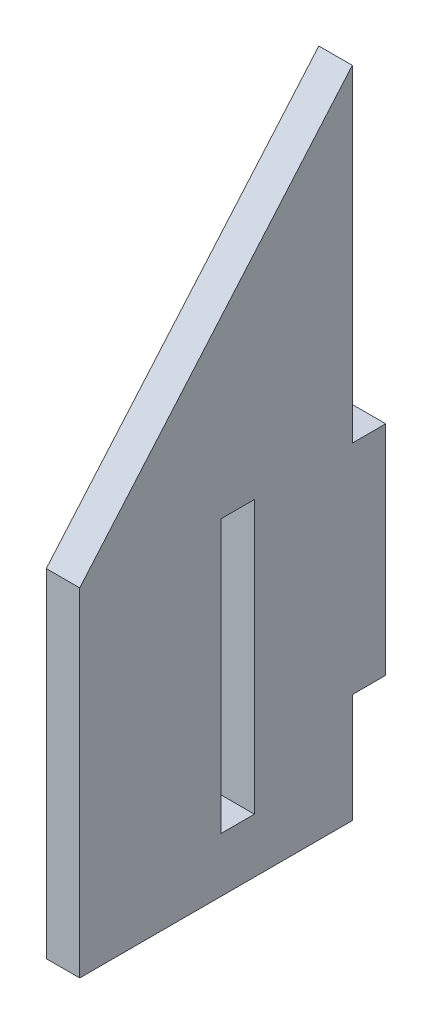
ISO-10303-21;
HEADER;
FILE_DESCRIPTION(('STEP AP214'),'2;1');
FILE_NAME('part.step','',(''),(''),'','','');
FILE_SCHEMA(('AUTOMOTIVE_DESIGN { 1 0 10303 214 1 1 1 1 }'));
ENDSEC;
DATA;
#1=APPLICATION_CONTEXT('core data for automotive mechanical design processes');
#2=APPLICATION_PROTOCOL_DEFINITION('international standard','automotive_design',2000,#1);
#3=PRODUCT_CONTEXT('',#1,'mechanical');
#4=PRODUCT('Part','Part','',(#3));
#5=PRODUCT_RELATED_PRODUCT_CATEGORY('part','',(#4));
#6=PRODUCT_DEFINITION_FORMATION('','',#4);
#7=PRODUCT_DEFINITION_CONTEXT('part definition',#1,'design');
#8=PRODUCT_DEFINITION('design','',#6,#7);
#9=PRODUCT_DEFINITION_SHAPE('','',#8);
#10=(LENGTH_UNIT() NAMED_UNIT(*) SI_UNIT(.MILLI.,.METRE.));
#11=(NAMED_UNIT(*) PLANE_ANGLE_UNIT() SI_UNIT($,.RADIAN.));
#12=(NAMED_UNIT(*) SI_UNIT($,.STERADIAN.) SOLID_ANGLE_UNIT());
#13=UNCERTAINTY_MEASURE_WITH_UNIT(LENGTH_MEASURE(1.E-05),#10,'distance_accuracy_value','');
#14=(GEOMETRIC_REPRESENTATION_CONTEXT(3) GLOBAL_UNCERTAINTY_ASSIGNED_CONTEXT((#13)) GLOBAL_UNIT_ASSIGNED_CONTEXT((#10,
#11,#12)) REPRESENTATION_CONTEXT('',''));
#15=CARTESIAN_POINT('',(0.,0.,0.));
#16=DIRECTION('',(0.,0.,1.));
#17=DIRECTION('',(1.,0.,0.));
#18=AXIS2_PLACEMENT_3D('',#15,#16,#17);
#19=CARTESIAN_POINT('',(38.92,-211.86,-3.08));
#20=DIRECTION('',(0.,0.,1.));
#21=DIRECTION('',(-1.,0.,0.));
#22=AXIS2_PLACEMENT_3D('',#19,#20,#21);
#23=PLANE('',#22);
#24=DIRECTION('',(0.,1.,0.));
#25=VECTOR('',#24,1.);
#26=CARTESIAN_POINT('',(41.99,-211.86,-3.08));
#27=LINE('',#26,#25);
#28=CARTESIAN_POINT('',(41.99,-211.86,-3.08));
#29=VERTEX_POINT('',#28);
#30=CARTESIAN_POINT('',(41.99,-191.88,-3.08));
#31=VERTEX_POINT('',#30);
#32=EDGE_CURVE('E156',#29,#31,#27,.T.);
#33=ORIENTED_EDGE('',*,*,#32,.F.);
#34=DIRECTION('',(1.,0.,0.));
#35=VECTOR('',#34,1.);
#36=CARTESIAN_POINT('',(38.92,-211.86,-3.08));
#37=LINE('',#36,#35);
#38=CARTESIAN_POINT('',(38.92,-211.86,-3.08));
#39=VERTEX_POINT('',#38);
#40=EDGE_CURVE('E183',#39,#29,#37,.T.);
#41=ORIENTED_EDGE('',*,*,#40,.F.);
#42=DIRECTION('',(0.,1.,0.));
#43=VECTOR('',#42,1.);
#44=CARTESIAN_POINT('',(38.92,-211.86,-3.08));
#45=LINE('',#44,#43);
#46=CARTESIAN_POINT('',(38.92,-191.88,-3.08));
#47=VERTEX_POINT('',#46);
#48=EDGE_CURVE('E159',#39,#47,#45,.T.);
#49=ORIENTED_EDGE('',*,*,#48,.T.);
#50=DIRECTION('',(1.,0.,0.));
#51=VECTOR('',#50,1.);
#52=CARTESIAN_POINT('',(38.92,-191.88,-3.08));
#53=LINE('',#52,#51);
#54=EDGE_CURVE('E225',#47,#31,#53,.T.);
#55=ORIENTED_EDGE('',*,*,#54,.T.);
#56=EDGE_LOOP('',(#33,#41,#49,#55));
#57=FACE_BOUND('',#56,.T.);
#58=ADVANCED_FACE('F43',(#57),#23,.F.);
#59=CARTESIAN_POINT('',(38.92,-191.88,-3.08));
#60=DIRECTION('',(0.,-1.,0.));
#61=DIRECTION('',(0.,0.,-1.));
#62=AXIS2_PLACEMENT_3D('',#59,#60,#61);
#63=PLANE('',#62);
#64=DIRECTION('',(0.,0.,1.));
#65=VECTOR('',#64,1.);
#66=CARTESIAN_POINT('',(41.99,-191.88,-3.08));
#67=LINE('',#66,#65);
#68=CARTESIAN_POINT('',(41.99,-191.88,-0.0100000000000005));
#69=VERTEX_POINT('',#68);
#70=EDGE_CURVE('E186',#31,#69,#67,.T.);
#71=ORIENTED_EDGE('',*,*,#70,.F.);
#72=ORIENTED_EDGE('',*,*,#54,.F.);
#73=DIRECTION('',(0.,0.,1.));
#74=VECTOR('',#73,1.);
#75=CARTESIAN_POINT('',(38.92,-191.88,-3.08));
#76=LINE('',#75,#74);
#77=CARTESIAN_POINT('',(38.92,-191.88,-0.0100000000000005));
#78=VERTEX_POINT('',#77);
#79=EDGE_CURVE('E162',#47,#78,#76,.T.);
#80=ORIENTED_EDGE('',*,*,#79,.T.);
#81=DIRECTION('',(1.,0.,0.));
#82=VECTOR('',#81,1.);
#83=CARTESIAN_POINT('',(38.92,-191.88,-0.0100000000000005));
#84=LINE('',#83,#82);
#85=EDGE_CURVE('E222',#78,#69,#84,.T.);
#86=ORIENTED_EDGE('',*,*,#85,.T.);
#87=EDGE_LOOP('',(#71,#72,#80,#86));
#88=FACE_BOUND('',#87,.T.);
#89=ADVANCED_FACE('F251',(#88),#63,.F.);
#90=CARTESIAN_POINT('',(38.92,-191.88,-0.0100000000000005));
#91=DIRECTION('',(0.,0.,1.));
#92=DIRECTION('',(-1.,0.,0.));
#93=AXIS2_PLACEMENT_3D('',#90,#91,#92);
#94=PLANE('',#93);
#95=DIRECTION('',(0.,1.,0.));
#96=VECTOR('',#95,1.);
#97=CARTESIAN_POINT('',(41.99,-191.88,-0.0100000000000005));
#98=LINE('',#97,#96);
#99=CARTESIAN_POINT('',(41.99,-161.87,-0.0100000000000005));
#100=VERTEX_POINT('',#99);
#101=EDGE_CURVE('E189',#69,#100,#98,.T.);
#102=ORIENTED_EDGE('',*,*,#101,.F.);
#103=ORIENTED_EDGE('',*,*,#85,.F.);
#104=DIRECTION('',(0.,1.,0.));
#105=VECTOR('',#104,1.);
#106=CARTESIAN_POINT('',(38.92,-191.88,-0.0100000000000005));
#107=LINE('',#106,#105);
#108=CARTESIAN_POINT('',(38.92,-161.87,-0.0100000000000005));
#109=VERTEX_POINT('',#108);
#110=EDGE_CURVE('E166',#78,#109,#107,.T.);
#111=ORIENTED_EDGE('',*,*,#110,.T.);
#112=DIRECTION('',(1.,0.,0.));
#113=VECTOR('',#112,1.);
#114=CARTESIAN_POINT('',(38.92,-161.87,-0.0100000000000005));
#115=LINE('',#114,#113);
#116=EDGE_CURVE('E219',#109,#100,#115,.T.);
#117=ORIENTED_EDGE('',*,*,#116,.T.);
#118=EDGE_LOOP('',(#102,#103,#111,#117));
#119=FACE_BOUND('',#118,.T.);
#120=ADVANCED_FACE('F257',(#119),#94,.F.);
#121=CARTESIAN_POINT('',(38.92,-161.87,-0.0100000000000005));
#122=DIRECTION('',(0.,-0.652810475445475,-0.757521275706929));
#123=DIRECTION('',(0.,0.757521275706929,-0.652810475445475));
#124=AXIS2_PLACEMENT_3D('',#121,#122,#123);
#125=PLANE('',#124);
#126=DIRECTION('',(0.,-0.757521275706929,0.652810475445475));
#127=VECTOR('',#126,1.);
#128=CARTESIAN_POINT('',(41.99,-161.87,-0.0100000000000005));
#129=LINE('',#128,#127);
#130=CARTESIAN_POINT('',(41.99,-190.88,24.99));
#131=VERTEX_POINT('',#130);
#132=EDGE_CURVE('E192',#100,#131,#129,.T.);
#133=ORIENTED_EDGE('',*,*,#132,.F.);
#134=ORIENTED_EDGE('',*,*,#116,.F.);
#135=DIRECTION('',(0.,-0.757521275706929,0.652810475445475));
#136=VECTOR('',#135,1.);
#137=CARTESIAN_POINT('',(38.92,-161.87,-0.0100000000000005));
#138=LINE('',#137,#136);
#139=CARTESIAN_POINT('',(38.92,-190.88,24.99));
#140=VERTEX_POINT('',#139);
#141=EDGE_CURVE('E169',#109,#140,#138,.T.);
#142=ORIENTED_EDGE('',*,*,#141,.T.);
#143=DIRECTION('',(1.,0.,0.));
#144=VECTOR('',#143,1.);
#145=CARTESIAN_POINT('',(38.92,-190.88,24.99));
#146=LINE('',#145,#144);
#147=EDGE_CURVE('E216',#140,#131,#146,.T.);
#148=ORIENTED_EDGE('',*,*,#147,.T.);
#149=EDGE_LOOP('',(#133,#134,#142,#148));
#150=FACE_BOUND('',#149,.T.);
#151=ADVANCED_FACE('F270',(#150),#125,.F.);
#152=CARTESIAN_POINT('',(38.92,-190.88,24.99));
#153=DIRECTION('',(0.,0.,-1.));
#154=DIRECTION('',(0.,1.,0.));
#155=AXIS2_PLACEMENT_3D('',#152,#153,#154);
#156=PLANE('',#155);
#157=DIRECTION('',(0.,-1.,0.));
#158=VECTOR('',#157,1.);
#159=CARTESIAN_POINT('',(41.99,-190.88,24.99));
#160=LINE('',#159,#158);
#161=CARTESIAN_POINT('',(41.99,-221.87,24.99));
#162=VERTEX_POINT('',#161);
#163=EDGE_CURVE('E195',#131,#162,#160,.T.);
#164=ORIENTED_EDGE('',*,*,#163,.F.);
#165=ORIENTED_EDGE('',*,*,#147,.F.);
#166=DIRECTION('',(0.,-1.,0.));
#167=VECTOR('',#166,1.);
#168=CARTESIAN_POINT('',(38.92,-190.88,24.99));
#169=LINE('',#168,#167);
#170=CARTESIAN_POINT('',(38.92,-221.87,24.99));
#171=VERTEX_POINT('',#170);
#172=EDGE_CURVE('E172',#140,#171,#169,.T.);
#173=ORIENTED_EDGE('',*,*,#172,.T.);
#174=DIRECTION('',(1.,0.,0.));
#175=VECTOR('',#174,1.);
#176=CARTESIAN_POINT('',(38.92,-221.87,24.99));
#177=LINE('',#176,#175);
#178=EDGE_CURVE('E213',#171,#162,#177,.T.);
#179=ORIENTED_EDGE('',*,*,#178,.T.);
#180=EDGE_LOOP('',(#164,#165,#173,#179));
#181=FACE_BOUND('',#180,.T.);
#182=ADVANCED_FACE('F273',(#181),#156,.F.);
#183=CARTESIAN_POINT('',(38.92,-221.87,24.99));
#184=DIRECTION('',(0.,1.,0.));
#185=DIRECTION('',(0.,0.,1.));
#186=AXIS2_PLACEMENT_3D('',#183,#184,#185);
#187=PLANE('',#186);
#188=DIRECTION('',(0.,0.,-1.));
#189=VECTOR('',#188,1.);
#190=CARTESIAN_POINT('',(41.99,-221.87,24.99));
#191=LINE('',#190,#189);
#192=CARTESIAN_POINT('',(41.99,-221.87,-0.00999999999999959));
#193=VERTEX_POINT('',#192);
#194=EDGE_CURVE('E198',#162,#193,#191,.T.);
#195=ORIENTED_EDGE('',*,*,#194,.F.);
#196=ORIENTED_EDGE('',*,*,#178,.F.);
#197=DIRECTION('',(0.,0.,-1.));
#198=VECTOR('',#197,1.);
#199=CARTESIAN_POINT('',(38.92,-221.87,24.99));
#200=LINE('',#199,#198);
#201=CARTESIAN_POINT('',(38.92,-221.87,-0.00999999999999959));
#202=VERTEX_POINT('',#201);
#203=EDGE_CURVE('E175',#171,#202,#200,.T.);
#204=ORIENTED_EDGE('',*,*,#203,.T.);
#205=DIRECTION('',(1.,0.,0.));
#206=VECTOR('',#205,1.);
#207=CARTESIAN_POINT('',(38.92,-221.87,-0.00999999999999959));
#208=LINE('',#207,#206);
#209=EDGE_CURVE('E210',#202,#193,#208,.T.);
#210=ORIENTED_EDGE('',*,*,#209,.T.);
#211=EDGE_LOOP('',(#195,#196,#204,#210));
#212=FACE_BOUND('',#211,.T.);
#213=ADVANCED_FACE('F276',(#212),#187,.F.);
#214=CARTESIAN_POINT('',(38.92,-221.87,-0.00999999999999959));
#215=DIRECTION('',(0.,0.,1.));
#216=DIRECTION('',(0.,-1.,0.));
#217=AXIS2_PLACEMENT_3D('',#214,#215,#216);
#218=PLANE('',#217);
#219=DIRECTION('',(0.,1.,0.));
#220=VECTOR('',#219,1.);
#221=CARTESIAN_POINT('',(41.99,-221.87,-0.00999999999999959));
#222=LINE('',#221,#220);
#223=CARTESIAN_POINT('',(41.99,-211.86,-0.0100000000000005));
#224=VERTEX_POINT('',#223);
#225=EDGE_CURVE('E201',#193,#224,#222,.T.);
#226=ORIENTED_EDGE('',*,*,#225,.F.);
#227=ORIENTED_EDGE('',*,*,#209,.F.);
#228=DIRECTION('',(0.,1.,0.));
#229=VECTOR('',#228,1.);
#230=CARTESIAN_POINT('',(38.92,-221.87,-0.00999999999999959));
#231=LINE('',#230,#229);
#232=CARTESIAN_POINT('',(38.92,-211.86,-0.0100000000000005));
#233=VERTEX_POINT('',#232);
#234=EDGE_CURVE('E178',#202,#233,#231,.T.);
#235=ORIENTED_EDGE('',*,*,#234,.T.);
#236=DIRECTION('',(1.,0.,0.));
#237=VECTOR('',#236,1.);
#238=CARTESIAN_POINT('',(38.92,-211.86,-0.0100000000000005));
#239=LINE('',#238,#237);
#240=EDGE_CURVE('E207',#233,#224,#239,.T.);
#241=ORIENTED_EDGE('',*,*,#240,.T.);
#242=EDGE_LOOP('',(#226,#227,#235,#241));
#243=FACE_BOUND('',#242,.T.);
#244=ADVANCED_FACE('F279',(#243),#218,.F.);
#245=CARTESIAN_POINT('',(38.92,-211.86,-0.0100000000000005));
#246=DIRECTION('',(0.,1.,0.));
#247=DIRECTION('',(0.,0.,1.));
#248=AXIS2_PLACEMENT_3D('',#245,#246,#247);
#249=PLANE('',#248);
#250=DIRECTION('',(0.,0.,-1.));
#251=VECTOR('',#250,1.);
#252=CARTESIAN_POINT('',(41.99,-211.86,-0.0100000000000005));
#253=LINE('',#252,#251);
#254=EDGE_CURVE('E163',#224,#29,#253,.T.);
#255=ORIENTED_EDGE('',*,*,#254,.F.);
#256=ORIENTED_EDGE('',*,*,#240,.F.);
#257=DIRECTION('',(0.,0.,-1.));
#258=VECTOR('',#257,1.);
#259=CARTESIAN_POINT('',(38.92,-211.86,-0.0100000000000005));
#260=LINE('',#259,#258);
#261=EDGE_CURVE('E181',#233,#39,#260,.T.);
#262=ORIENTED_EDGE('',*,*,#261,.T.);
#263=ORIENTED_EDGE('',*,*,#40,.T.);
#264=EDGE_LOOP('',(#255,#256,#262,#263));
#265=FACE_BOUND('',#264,.T.);
#266=ADVANCED_FACE('F264',(#265),#249,.F.);
#267=CARTESIAN_POINT('',(38.92,0.,0.));
#268=DIRECTION('',(-1.,0.,0.));
#269=DIRECTION('',(0.,0.,-1.));
#270=AXIS2_PLACEMENT_3D('',#267,#268,#269);
#271=PLANE('',#270);
#272=DIRECTION('',(0.,-1.,0.));
#273=VECTOR('',#272,1.);
#274=CARTESIAN_POINT('',(38.92,-191.87,12.035));
#275=LINE('',#274,#273);
#276=CARTESIAN_POINT('',(38.92,-191.87,12.035));
#277=VERTEX_POINT('',#276);
#278=CARTESIAN_POINT('',(38.92,-216.87,12.035));
#279=VERTEX_POINT('',#278);
#280=EDGE_CURVE('E149',#277,#279,#275,.T.);
#281=ORIENTED_EDGE('',*,*,#280,.T.);
#282=DIRECTION('',(0.,0.,-1.));
#283=VECTOR('',#282,1.);
#284=CARTESIAN_POINT('',(38.92,-216.87,8.96499999999998));
#285=LINE('',#284,#283);
#286=CARTESIAN_POINT('',(38.92,-216.87,8.96499999999998));
#287=VERTEX_POINT('',#286);
#288=EDGE_CURVE('E132',#279,#287,#285,.T.);
#289=ORIENTED_EDGE('',*,*,#288,.T.);
#290=DIRECTION('',(0.,1.,0.));
#291=VECTOR('',#290,1.);
#292=CARTESIAN_POINT('',(38.92,-191.87,8.96499999999999));
#293=LINE('',#292,#291);
#294=CARTESIAN_POINT('',(38.92,-191.87,8.96499999999999));
#295=VERTEX_POINT('',#294);
#296=EDGE_CURVE('E140',#287,#295,#293,.T.);
#297=ORIENTED_EDGE('',*,*,#296,.T.);
#298=DIRECTION('',(0.,0.,1.));
#299=VECTOR('',#298,1.);
#300=CARTESIAN_POINT('',(38.92,-191.87,8.96499999999999));
#301=LINE('',#300,#299);
#302=EDGE_CURVE('E145',#295,#277,#301,.T.);
#303=ORIENTED_EDGE('',*,*,#302,.T.);
#304=EDGE_LOOP('',(#281,#289,#297,#303));
#305=FACE_BOUND('',#304,.T.);
#306=ORIENTED_EDGE('',*,*,#48,.F.);
#307=ORIENTED_EDGE('',*,*,#261,.F.);
#308=ORIENTED_EDGE('',*,*,#234,.F.);
#309=ORIENTED_EDGE('',*,*,#203,.F.);
#310=ORIENTED_EDGE('',*,*,#172,.F.);
#311=ORIENTED_EDGE('',*,*,#141,.F.);
#312=ORIENTED_EDGE('',*,*,#110,.F.);
#313=ORIENTED_EDGE('',*,*,#79,.F.);
#314=EDGE_LOOP('',(#306,#307,#308,#309,#310,#311,#312,#313));
#315=FACE_BOUND('',#314,.T.);
#316=ADVANCED_FACE('F147',(#305,#315),#271,.T.);
#317=CARTESIAN_POINT('',(41.99,0.,0.));
#318=DIRECTION('',(-1.,0.,0.));
#319=DIRECTION('',(0.,0.,-1.));
#320=AXIS2_PLACEMENT_3D('',#317,#318,#319);
#321=PLANE('',#320);
#322=DIRECTION('',(0.,0.,1.));
#323=VECTOR('',#322,1.);
#324=CARTESIAN_POINT('',(41.99,-191.87,0.));
#325=LINE('',#324,#323);
#326=CARTESIAN_POINT('',(41.9899999999999,-191.87,8.96499999999999));
#327=VERTEX_POINT('',#326);
#328=CARTESIAN_POINT('',(41.9899999999999,-191.87,12.035));
#329=VERTEX_POINT('',#328);
#330=EDGE_CURVE('E50',#327,#329,#325,.T.);
#331=ORIENTED_EDGE('',*,*,#330,.F.);
#332=DIRECTION('',(0.,1.,0.));
#333=VECTOR('',#332,1.);
#334=CARTESIAN_POINT('',(41.99,0.,8.96500000000001));
#335=LINE('',#334,#333);
#336=CARTESIAN_POINT('',(41.99,-216.87,8.96499999999998));
#337=VERTEX_POINT('',#336);
#338=EDGE_CURVE('E229',#337,#327,#335,.T.);
#339=ORIENTED_EDGE('',*,*,#338,.F.);
#340=DIRECTION('',(0.,0.,-1.));
#341=VECTOR('',#340,1.);
#342=CARTESIAN_POINT('',(41.99,-216.87,0.));
#343=LINE('',#342,#341);
#344=CARTESIAN_POINT('',(41.9899999999999,-216.87,12.035));
#345=VERTEX_POINT('',#344);
#346=EDGE_CURVE('E135',#345,#337,#343,.T.);
#347=ORIENTED_EDGE('',*,*,#346,.F.);
#348=DIRECTION('',(0.,-1.,0.));
#349=VECTOR('',#348,1.);
#350=CARTESIAN_POINT('',(41.99,0.,12.035));
#351=LINE('',#350,#349);
#352=EDGE_CURVE('E11',#329,#345,#351,.T.);
#353=ORIENTED_EDGE('',*,*,#352,.F.);
#354=EDGE_LOOP('',(#331,#339,#347,#353));
#355=FACE_BOUND('',#354,.T.);
#356=ORIENTED_EDGE('',*,*,#32,.T.);
#357=ORIENTED_EDGE('',*,*,#70,.T.);
#358=ORIENTED_EDGE('',*,*,#101,.T.);
#359=ORIENTED_EDGE('',*,*,#132,.T.);
#360=ORIENTED_EDGE('',*,*,#163,.T.);
#361=ORIENTED_EDGE('',*,*,#194,.T.);
#362=ORIENTED_EDGE('',*,*,#225,.T.);
#363=ORIENTED_EDGE('',*,*,#254,.T.);
#364=EDGE_LOOP('',(#356,#357,#358,#359,#360,#361,#362,#363));
#365=FACE_BOUND('',#364,.T.);
#366=ADVANCED_FACE('F236',(#355,#365),#321,.F.);
#367=CARTESIAN_POINT('',(130.,-191.87,12.035));
#368=DIRECTION('',(0.,0.,1.));
#369=DIRECTION('',(0.,-1.,0.));
#370=AXIS2_PLACEMENT_3D('',#367,#368,#369);
#371=PLANE('',#370);
#372=DIRECTION('',(-1.,0.,0.));
#373=VECTOR('',#372,1.);
#374=CARTESIAN_POINT('',(130.,-191.87,12.035));
#375=LINE('',#374,#373);
#376=EDGE_CURVE('E154',#329,#277,#375,.T.);
#377=ORIENTED_EDGE('',*,*,#376,.F.);
#378=ORIENTED_EDGE('',*,*,#352,.T.);
#379=DIRECTION('',(-1.,0.,0.));
#380=VECTOR('',#379,1.);
#381=CARTESIAN_POINT('',(130.,-216.87,12.035));
#382=LINE('',#381,#380);
#383=EDGE_CURVE('E56',#345,#279,#382,.T.);
#384=ORIENTED_EDGE('',*,*,#383,.T.);
#385=ORIENTED_EDGE('',*,*,#280,.F.);
#386=EDGE_LOOP('',(#377,#378,#384,#385));
#387=FACE_BOUND('',#386,.T.);
#388=ADVANCED_FACE('F238',(#387),#371,.F.);
#389=CARTESIAN_POINT('',(130.,-191.87,8.96499999999999));
#390=DIRECTION('',(0.,1.,0.));
#391=DIRECTION('',(0.,0.,1.));
#392=AXIS2_PLACEMENT_3D('',#389,#390,#391);
#393=PLANE('',#392);
#394=DIRECTION('',(-1.,0.,0.));
#395=VECTOR('',#394,1.);
#396=CARTESIAN_POINT('',(130.,-191.87,8.96499999999999));
#397=LINE('',#396,#395);
#398=EDGE_CURVE('E137',#327,#295,#397,.T.);
#399=ORIENTED_EDGE('',*,*,#398,.F.);
#400=ORIENTED_EDGE('',*,*,#330,.T.);
#401=ORIENTED_EDGE('',*,*,#376,.T.);
#402=ORIENTED_EDGE('',*,*,#302,.F.);
#403=EDGE_LOOP('',(#399,#400,#401,#402));
#404=FACE_BOUND('',#403,.T.);
#405=ADVANCED_FACE('F233',(#404),#393,.F.);
#406=CARTESIAN_POINT('',(130.,-191.87,8.96499999999999));
#407=DIRECTION('',(0.,0.,-1.));
#408=DIRECTION('',(0.,1.,0.));
#409=AXIS2_PLACEMENT_3D('',#406,#407,#408);
#410=PLANE('',#409);
#411=DIRECTION('',(-1.,0.,0.));
#412=VECTOR('',#411,1.);
#413=CARTESIAN_POINT('',(130.,-216.87,8.96499999999998));
#414=LINE('',#413,#412);
#415=EDGE_CURVE('E64',#337,#287,#414,.T.);
#416=ORIENTED_EDGE('',*,*,#415,.F.);
#417=ORIENTED_EDGE('',*,*,#338,.T.);
#418=ORIENTED_EDGE('',*,*,#398,.T.);
#419=ORIENTED_EDGE('',*,*,#296,.F.);
#420=EDGE_LOOP('',(#416,#417,#418,#419));
#421=FACE_BOUND('',#420,.T.);
#422=ADVANCED_FACE('F141',(#421),#410,.F.);
#423=CARTESIAN_POINT('',(130.,-216.87,8.96499999999998));
#424=DIRECTION('',(0.,-1.,0.));
#425=DIRECTION('',(0.,0.,-1.));
#426=AXIS2_PLACEMENT_3D('',#423,#424,#425);
#427=PLANE('',#426);
#428=ORIENTED_EDGE('',*,*,#383,.F.);
#429=ORIENTED_EDGE('',*,*,#346,.T.);
#430=ORIENTED_EDGE('',*,*,#415,.T.);
#431=ORIENTED_EDGE('',*,*,#288,.F.);
#432=EDGE_LOOP('',(#428,#429,#430,#431));
#433=FACE_BOUND('',#432,.T.);
#434=ADVANCED_FACE('F130',(#433),#427,.F.);
#435=CLOSED_SHELL('',(#58,#89,#120,#151,#182,#213,#244,#266,#316,#366,#388,#405,#422,#434));
#436=MANIFOLD_SOLID_BREP('B2',#435);
#437=ADVANCED_BREP_SHAPE_REPRESENTATION('',(#18,#436),#14);
#438=SHAPE_DEFINITION_REPRESENTATION(#9,#437);
ENDSEC;
END-ISO-10303-21;
